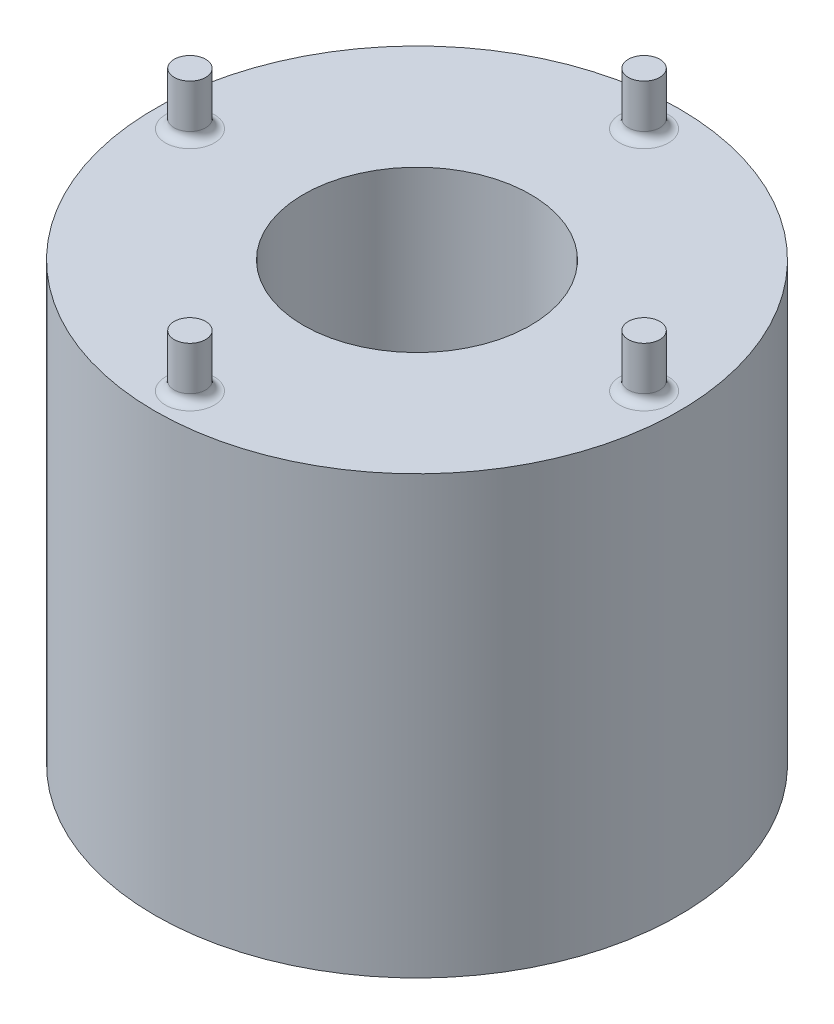
ISO-10303-21;
HEADER;
FILE_DESCRIPTION(('STEP AP214'),'2;1');
FILE_NAME('part.step','',(''),(''),'','','');
FILE_SCHEMA(('AUTOMOTIVE_DESIGN { 1 0 10303 214 1 1 1 1 }'));
ENDSEC;
DATA;
#1=APPLICATION_CONTEXT('core data for automotive mechanical design processes');
#2=APPLICATION_PROTOCOL_DEFINITION('international standard','automotive_design',2000,#1);
#3=PRODUCT_CONTEXT('',#1,'mechanical');
#4=PRODUCT('Part','Part','',(#3));
#5=PRODUCT_RELATED_PRODUCT_CATEGORY('part','',(#4));
#6=PRODUCT_DEFINITION_FORMATION('','',#4);
#7=PRODUCT_DEFINITION_CONTEXT('part definition',#1,'design');
#8=PRODUCT_DEFINITION('design','',#6,#7);
#9=PRODUCT_DEFINITION_SHAPE('','',#8);
#10=(LENGTH_UNIT() NAMED_UNIT(*) SI_UNIT(.MILLI.,.METRE.));
#11=(NAMED_UNIT(*) PLANE_ANGLE_UNIT() SI_UNIT($,.RADIAN.));
#12=(NAMED_UNIT(*) SI_UNIT($,.STERADIAN.) SOLID_ANGLE_UNIT());
#13=UNCERTAINTY_MEASURE_WITH_UNIT(LENGTH_MEASURE(1.E-05),#10,'distance_accuracy_value','');
#14=(GEOMETRIC_REPRESENTATION_CONTEXT(3) GLOBAL_UNCERTAINTY_ASSIGNED_CONTEXT((#13)) GLOBAL_UNIT_ASSIGNED_CONTEXT((#10,
#11,#12)) REPRESENTATION_CONTEXT('',''));
#15=CARTESIAN_POINT('',(0.,0.,0.));
#16=DIRECTION('',(0.,0.,1.));
#17=DIRECTION('',(1.,0.,0.));
#18=AXIS2_PLACEMENT_3D('',#15,#16,#17);
#19=CARTESIAN_POINT('',(0.,10.,0.));
#20=DIRECTION('',(0.,-1.,0.));
#21=DIRECTION('',(0.,0.,-1.));
#22=AXIS2_PLACEMENT_3D('',#19,#20,#21);
#23=CYLINDRICAL_SURFACE('',#22,15.);
#24=CARTESIAN_POINT('',(0.,0.,0.));
#25=DIRECTION('',(0.,1.,0.));
#26=DIRECTION('',(0.,0.,1.));
#27=AXIS2_PLACEMENT_3D('',#24,#25,#26);
#28=CIRCLE('',#27,15.);
#29=CARTESIAN_POINT('',(0.,0.,15.));
#30=VERTEX_POINT('',#29);
#31=EDGE_CURVE('E63',#30,#30,#28,.T.);
#32=ORIENTED_EDGE('',*,*,#31,.T.);
#33=EDGE_LOOP('',(#32));
#34=FACE_BOUND('',#33,.T.);
#35=CARTESIAN_POINT('',(0.,25.,0.));
#36=DIRECTION('',(0.,1.,0.));
#37=DIRECTION('',(0.,0.,1.));
#38=AXIS2_PLACEMENT_3D('',#35,#36,#37);
#39=CIRCLE('',#38,15.);
#40=CARTESIAN_POINT('',(0.,25.,15.));
#41=VERTEX_POINT('',#40);
#42=EDGE_CURVE('E66',#41,#41,#39,.T.);
#43=ORIENTED_EDGE('',*,*,#42,.F.);
#44=EDGE_LOOP('',(#43));
#45=FACE_BOUND('',#44,.T.);
#46=ADVANCED_FACE('F31',(#34,#45),#23,.T.);
#47=CARTESIAN_POINT('',(0.,0.,0.));
#48=DIRECTION('',(0.,1.,0.));
#49=DIRECTION('',(0.,0.,1.));
#50=AXIS2_PLACEMENT_3D('',#47,#48,#49);
#51=PLANE('',#50);
#52=ORIENTED_EDGE('',*,*,#31,.F.);
#53=EDGE_LOOP('',(#52));
#54=FACE_BOUND('',#53,.T.);
#55=ADVANCED_FACE('F117',(#54),#51,.F.);
#56=CARTESIAN_POINT('',(0.,25.,0.));
#57=DIRECTION('',(0.,1.,0.));
#58=DIRECTION('',(0.,0.,1.));
#59=AXIS2_PLACEMENT_3D('',#56,#57,#58);
#60=PLANE('',#59);
#61=CARTESIAN_POINT('',(0.,25.,0.));
#62=DIRECTION('',(0.,1.,0.));
#63=DIRECTION('',(0.,0.,1.));
#64=AXIS2_PLACEMENT_3D('',#61,#62,#63);
#65=CIRCLE('',#64,6.5);
#66=CARTESIAN_POINT('',(0.,25.,6.5));
#67=VERTEX_POINT('',#66);
#68=EDGE_CURVE('E82',#67,#67,#65,.T.);
#69=ORIENTED_EDGE('',*,*,#68,.F.);
#70=EDGE_LOOP('',(#69));
#71=FACE_BOUND('',#70,.T.);
#72=CARTESIAN_POINT('',(-13.,25.,1.36167772214882E-13));
#73=DIRECTION('',(0.,1.,0.));
#74=DIRECTION('',(0.,0.,1.));
#75=AXIS2_PLACEMENT_3D('',#72,#73,#74);
#76=CIRCLE('',#75,1.4);
#77=CARTESIAN_POINT('',(-13.,25.,1.40000000000014));
#78=VERTEX_POINT('',#77);
#79=EDGE_CURVE('E10',#78,#78,#76,.F.);
#80=ORIENTED_EDGE('',*,*,#79,.T.);
#81=EDGE_LOOP('',(#80));
#82=FACE_BOUND('',#81,.T.);
#83=CARTESIAN_POINT('',(0.,25.,-13.));
#84=DIRECTION('',(0.,1.,0.));
#85=DIRECTION('',(0.,0.,1.));
#86=AXIS2_PLACEMENT_3D('',#83,#84,#85);
#87=CIRCLE('',#86,1.4);
#88=CARTESIAN_POINT('',(0.,25.,-11.6));
#89=VERTEX_POINT('',#88);
#90=EDGE_CURVE('E42',#89,#89,#87,.F.);
#91=ORIENTED_EDGE('',*,*,#90,.T.);
#92=EDGE_LOOP('',(#91));
#93=FACE_BOUND('',#92,.T.);
#94=CARTESIAN_POINT('',(13.,25.,0.));
#95=DIRECTION('',(0.,1.,0.));
#96=DIRECTION('',(0.,0.,1.));
#97=AXIS2_PLACEMENT_3D('',#94,#95,#96);
#98=CIRCLE('',#97,1.4);
#99=CARTESIAN_POINT('',(13.,25.,1.39999999999995));
#100=VERTEX_POINT('',#99);
#101=EDGE_CURVE('E51',#100,#100,#98,.F.);
#102=ORIENTED_EDGE('',*,*,#101,.T.);
#103=EDGE_LOOP('',(#102));
#104=FACE_BOUND('',#103,.T.);
#105=CARTESIAN_POINT('',(0.,25.,13.));
#106=DIRECTION('',(0.,1.,0.));
#107=DIRECTION('',(0.,0.,1.));
#108=AXIS2_PLACEMENT_3D('',#105,#106,#107);
#109=CIRCLE('',#108,1.4);
#110=CARTESIAN_POINT('',(0.,25.,14.4));
#111=VERTEX_POINT('',#110);
#112=EDGE_CURVE('E57',#111,#111,#109,.F.);
#113=ORIENTED_EDGE('',*,*,#112,.T.);
#114=EDGE_LOOP('',(#113));
#115=FACE_BOUND('',#114,.T.);
#116=ORIENTED_EDGE('',*,*,#42,.T.);
#117=EDGE_LOOP('',(#116));
#118=FACE_BOUND('',#117,.T.);
#119=ADVANCED_FACE('F114',(#71,#82,#93,#104,#115,#118),#60,.T.);
#120=CARTESIAN_POINT('',(0.,28.,13.));
#121=DIRECTION('',(0.,-1.,0.));
#122=DIRECTION('',(0.,0.,-1.));
#123=AXIS2_PLACEMENT_3D('',#120,#121,#122);
#124=CYLINDRICAL_SURFACE('',#123,0.9);
#125=CARTESIAN_POINT('',(0.,25.5,13.));
#126=DIRECTION('',(0.,1.,0.));
#127=DIRECTION('',(0.,0.,1.));
#128=AXIS2_PLACEMENT_3D('',#125,#126,#127);
#129=CIRCLE('',#128,0.9);
#130=CARTESIAN_POINT('',(0.,25.5,13.9));
#131=VERTEX_POINT('',#130);
#132=EDGE_CURVE('E60',#131,#131,#129,.T.);
#133=ORIENTED_EDGE('',*,*,#132,.T.);
#134=EDGE_LOOP('',(#133));
#135=FACE_BOUND('',#134,.T.);
#136=CARTESIAN_POINT('',(0.,28.,13.));
#137=DIRECTION('',(0.,1.,0.));
#138=DIRECTION('',(0.,0.,1.));
#139=AXIS2_PLACEMENT_3D('',#136,#137,#138);
#140=CIRCLE('',#139,0.9);
#141=CARTESIAN_POINT('',(0.,28.,13.9));
#142=VERTEX_POINT('',#141);
#143=EDGE_CURVE('E69',#142,#142,#140,.T.);
#144=ORIENTED_EDGE('',*,*,#143,.F.);
#145=EDGE_LOOP('',(#144));
#146=FACE_BOUND('',#145,.T.);
#147=ADVANCED_FACE('F116',(#135,#146),#124,.T.);
#148=CARTESIAN_POINT('',(0.,28.,13.));
#149=DIRECTION('',(0.,1.,0.));
#150=DIRECTION('',(0.,0.,1.));
#151=AXIS2_PLACEMENT_3D('',#148,#149,#150);
#152=PLANE('',#151);
#153=ORIENTED_EDGE('',*,*,#143,.T.);
#154=EDGE_LOOP('',(#153));
#155=FACE_BOUND('',#154,.T.);
#156=ADVANCED_FACE('F141',(#155),#152,.T.);
#157=CARTESIAN_POINT('',(0.,25.5,13.));
#158=DIRECTION('',(0.,1.,0.));
#159=DIRECTION('',(0.,0.,1.));
#160=AXIS2_PLACEMENT_3D('',#157,#158,#159);
#161=TOROIDAL_SURFACE('',#160,1.4,0.5);
#162=ORIENTED_EDGE('',*,*,#112,.F.);
#163=EDGE_LOOP('',(#162));
#164=FACE_BOUND('',#163,.T.);
#165=ORIENTED_EDGE('',*,*,#132,.F.);
#166=EDGE_LOOP('',(#165));
#167=FACE_BOUND('',#166,.T.);
#168=ADVANCED_FACE('F137',(#164,#167),#161,.F.);
#169=CARTESIAN_POINT('',(13.,28.,0.));
#170=DIRECTION('',(0.,-1.,0.));
#171=DIRECTION('',(0.,0.,-1.));
#172=AXIS2_PLACEMENT_3D('',#169,#170,#171);
#173=CYLINDRICAL_SURFACE('',#172,0.9);
#174=CARTESIAN_POINT('',(13.,25.5,0.));
#175=DIRECTION('',(0.,1.,0.));
#176=DIRECTION('',(0.,0.,1.));
#177=AXIS2_PLACEMENT_3D('',#174,#175,#176);
#178=CIRCLE('',#177,0.9);
#179=CARTESIAN_POINT('',(13.,25.5,0.899999999999954));
#180=VERTEX_POINT('',#179);
#181=EDGE_CURVE('E54',#180,#180,#178,.T.);
#182=ORIENTED_EDGE('',*,*,#181,.T.);
#183=EDGE_LOOP('',(#182));
#184=FACE_BOUND('',#183,.T.);
#185=CARTESIAN_POINT('',(13.,28.,0.));
#186=DIRECTION('',(0.,1.,0.));
#187=DIRECTION('',(1.,0.,0.));
#188=AXIS2_PLACEMENT_3D('',#185,#186,#187);
#189=CIRCLE('',#188,0.9);
#190=CARTESIAN_POINT('',(13.9,28.,0.));
#191=VERTEX_POINT('',#190);
#192=EDGE_CURVE('E72',#191,#191,#189,.T.);
#193=ORIENTED_EDGE('',*,*,#192,.F.);
#194=EDGE_LOOP('',(#193));
#195=FACE_BOUND('',#194,.T.);
#196=ADVANCED_FACE('F140',(#184,#195),#173,.T.);
#197=CARTESIAN_POINT('',(13.,28.,0.));
#198=DIRECTION('',(0.,1.,0.));
#199=DIRECTION('',(1.,0.,0.));
#200=AXIS2_PLACEMENT_3D('',#197,#198,#199);
#201=PLANE('',#200);
#202=ORIENTED_EDGE('',*,*,#192,.T.);
#203=EDGE_LOOP('',(#202));
#204=FACE_BOUND('',#203,.T.);
#205=ADVANCED_FACE('F161',(#204),#201,.T.);
#206=CARTESIAN_POINT('',(0.,28.,-13.));
#207=DIRECTION('',(0.,-1.,0.));
#208=DIRECTION('',(0.,0.,-1.));
#209=AXIS2_PLACEMENT_3D('',#206,#207,#208);
#210=CYLINDRICAL_SURFACE('',#209,0.9);
#211=CARTESIAN_POINT('',(0.,25.5,-13.));
#212=DIRECTION('',(0.,1.,0.));
#213=DIRECTION('',(0.,0.,1.));
#214=AXIS2_PLACEMENT_3D('',#211,#212,#213);
#215=CIRCLE('',#214,0.9);
#216=CARTESIAN_POINT('',(0.,25.5,-12.1));
#217=VERTEX_POINT('',#216);
#218=EDGE_CURVE('E46',#217,#217,#215,.T.);
#219=ORIENTED_EDGE('',*,*,#218,.T.);
#220=EDGE_LOOP('',(#219));
#221=FACE_BOUND('',#220,.T.);
#222=CARTESIAN_POINT('',(0.,28.,-13.));
#223=DIRECTION('',(0.,1.,0.));
#224=DIRECTION('',(0.,0.,-1.));
#225=AXIS2_PLACEMENT_3D('',#222,#223,#224);
#226=CIRCLE('',#225,0.9);
#227=CARTESIAN_POINT('',(0.,28.,-13.9));
#228=VERTEX_POINT('',#227);
#229=EDGE_CURVE('E75',#228,#228,#226,.T.);
#230=ORIENTED_EDGE('',*,*,#229,.F.);
#231=EDGE_LOOP('',(#230));
#232=FACE_BOUND('',#231,.T.);
#233=ADVANCED_FACE('F157',(#221,#232),#210,.T.);
#234=CARTESIAN_POINT('',(0.,28.,-13.));
#235=DIRECTION('',(0.,1.,0.));
#236=DIRECTION('',(0.,0.,-1.));
#237=AXIS2_PLACEMENT_3D('',#234,#235,#236);
#238=PLANE('',#237);
#239=ORIENTED_EDGE('',*,*,#229,.T.);
#240=EDGE_LOOP('',(#239));
#241=FACE_BOUND('',#240,.T.);
#242=ADVANCED_FACE('F160',(#241),#238,.T.);
#243=CARTESIAN_POINT('',(-13.,28.,1.36167772214882E-13));
#244=DIRECTION('',(0.,-1.,0.));
#245=DIRECTION('',(0.,0.,-1.));
#246=AXIS2_PLACEMENT_3D('',#243,#244,#245);
#247=CYLINDRICAL_SURFACE('',#246,0.9);
#248=CARTESIAN_POINT('',(-13.,25.5,1.36167772214882E-13));
#249=DIRECTION('',(0.,1.,0.));
#250=DIRECTION('',(0.,0.,1.));
#251=AXIS2_PLACEMENT_3D('',#248,#249,#250);
#252=CIRCLE('',#251,0.9);
#253=CARTESIAN_POINT('',(-13.,25.5,0.900000000000136));
#254=VERTEX_POINT('',#253);
#255=EDGE_CURVE('E38',#254,#254,#252,.T.);
#256=ORIENTED_EDGE('',*,*,#255,.T.);
#257=EDGE_LOOP('',(#256));
#258=FACE_BOUND('',#257,.T.);
#259=CARTESIAN_POINT('',(-13.,28.,1.36167772214882E-13));
#260=DIRECTION('',(0.,1.,0.));
#261=DIRECTION('',(-1.,0.,0.));
#262=AXIS2_PLACEMENT_3D('',#259,#260,#261);
#263=CIRCLE('',#262,0.9);
#264=CARTESIAN_POINT('',(-13.9,28.,1.45594771829759E-13));
#265=VERTEX_POINT('',#264);
#266=EDGE_CURVE('E78',#265,#265,#263,.T.);
#267=ORIENTED_EDGE('',*,*,#266,.F.);
#268=EDGE_LOOP('',(#267));
#269=FACE_BOUND('',#268,.T.);
#270=ADVANCED_FACE('F166',(#258,#269),#247,.T.);
#271=CARTESIAN_POINT('',(-13.,28.,1.36167772214882E-13));
#272=DIRECTION('',(0.,1.,0.));
#273=DIRECTION('',(-1.,0.,0.));
#274=AXIS2_PLACEMENT_3D('',#271,#272,#273);
#275=PLANE('',#274);
#276=ORIENTED_EDGE('',*,*,#266,.T.);
#277=EDGE_LOOP('',(#276));
#278=FACE_BOUND('',#277,.T.);
#279=ADVANCED_FACE('F146',(#278),#275,.T.);
#280=CARTESIAN_POINT('',(13.,25.5,0.));
#281=DIRECTION('',(0.,1.,0.));
#282=DIRECTION('',(0.,0.,1.));
#283=AXIS2_PLACEMENT_3D('',#280,#281,#282);
#284=TOROIDAL_SURFACE('',#283,1.4,0.5);
#285=ORIENTED_EDGE('',*,*,#101,.F.);
#286=EDGE_LOOP('',(#285));
#287=FACE_BOUND('',#286,.T.);
#288=ORIENTED_EDGE('',*,*,#181,.F.);
#289=EDGE_LOOP('',(#288));
#290=FACE_BOUND('',#289,.T.);
#291=ADVANCED_FACE('F143',(#287,#290),#284,.F.);
#292=CARTESIAN_POINT('',(0.,25.5,-13.));
#293=DIRECTION('',(0.,1.,0.));
#294=DIRECTION('',(0.,0.,1.));
#295=AXIS2_PLACEMENT_3D('',#292,#293,#294);
#296=TOROIDAL_SURFACE('',#295,1.4,0.5);
#297=ORIENTED_EDGE('',*,*,#90,.F.);
#298=EDGE_LOOP('',(#297));
#299=FACE_BOUND('',#298,.T.);
#300=ORIENTED_EDGE('',*,*,#218,.F.);
#301=EDGE_LOOP('',(#300));
#302=FACE_BOUND('',#301,.T.);
#303=ADVANCED_FACE('F145',(#299,#302),#296,.F.);
#304=CARTESIAN_POINT('',(-13.,25.5,1.36167772214882E-13));
#305=DIRECTION('',(0.,1.,0.));
#306=DIRECTION('',(0.,0.,1.));
#307=AXIS2_PLACEMENT_3D('',#304,#305,#306);
#308=TOROIDAL_SURFACE('',#307,1.4,0.5);
#309=ORIENTED_EDGE('',*,*,#79,.F.);
#310=EDGE_LOOP('',(#309));
#311=FACE_BOUND('',#310,.T.);
#312=ORIENTED_EDGE('',*,*,#255,.F.);
#313=EDGE_LOOP('',(#312));
#314=FACE_BOUND('',#313,.T.);
#315=ADVANCED_FACE('F33',(#311,#314),#308,.F.);
#316=CARTESIAN_POINT('',(0.,15.,0.));
#317=DIRECTION('',(0.,1.,0.));
#318=DIRECTION('',(0.,0.,1.));
#319=AXIS2_PLACEMENT_3D('',#316,#317,#318);
#320=CYLINDRICAL_SURFACE('',#319,6.5);
#321=CARTESIAN_POINT('',(0.,15.,0.));
#322=DIRECTION('',(0.,1.,0.));
#323=DIRECTION('',(0.,0.,1.));
#324=AXIS2_PLACEMENT_3D('',#321,#322,#323);
#325=CIRCLE('',#324,6.5);
#326=CARTESIAN_POINT('',(0.,15.,6.5));
#327=VERTEX_POINT('',#326);
#328=EDGE_CURVE('E81',#327,#327,#325,.T.);
#329=ORIENTED_EDGE('',*,*,#328,.F.);
#330=EDGE_LOOP('',(#329));
#331=FACE_BOUND('',#330,.T.);
#332=ORIENTED_EDGE('',*,*,#68,.T.);
#333=EDGE_LOOP('',(#332));
#334=FACE_BOUND('',#333,.T.);
#335=ADVANCED_FACE('F105',(#331,#334),#320,.F.);
#336=CARTESIAN_POINT('',(0.,15.,0.));
#337=DIRECTION('',(0.,1.,0.));
#338=DIRECTION('',(0.,0.,1.));
#339=AXIS2_PLACEMENT_3D('',#336,#337,#338);
#340=PLANE('',#339);
#341=CARTESIAN_POINT('',(0.,15.,0.));
#342=DIRECTION('',(0.,1.,0.));
#343=DIRECTION('',(0.,0.,1.));
#344=AXIS2_PLACEMENT_3D('',#341,#342,#343);
#345=CIRCLE('',#344,1.75);
#346=CARTESIAN_POINT('',(0.,15.,1.75));
#347=VERTEX_POINT('',#346);
#348=EDGE_CURVE('E88',#347,#347,#345,.T.);
#349=ORIENTED_EDGE('',*,*,#348,.F.);
#350=EDGE_LOOP('',(#349));
#351=FACE_BOUND('',#350,.T.);
#352=ORIENTED_EDGE('',*,*,#328,.T.);
#353=EDGE_LOOP('',(#352));
#354=FACE_BOUND('',#353,.T.);
#355=ADVANCED_FACE('F99',(#351,#354),#340,.T.);
#356=CARTESIAN_POINT('',(0.,5.,0.));
#357=DIRECTION('',(0.,1.,0.));
#358=DIRECTION('',(0.,0.,1.));
#359=AXIS2_PLACEMENT_3D('',#356,#357,#358);
#360=CYLINDRICAL_SURFACE('',#359,1.75);
#361=CARTESIAN_POINT('',(0.,5.,0.));
#362=DIRECTION('',(0.,1.,0.));
#363=DIRECTION('',(0.,0.,1.));
#364=AXIS2_PLACEMENT_3D('',#361,#362,#363);
#365=CIRCLE('',#364,1.75);
#366=CARTESIAN_POINT('',(0.,5.,1.75));
#367=VERTEX_POINT('',#366);
#368=EDGE_CURVE('E85',#367,#367,#365,.T.);
#369=ORIENTED_EDGE('',*,*,#368,.F.);
#370=EDGE_LOOP('',(#369));
#371=FACE_BOUND('',#370,.T.);
#372=ORIENTED_EDGE('',*,*,#348,.T.);
#373=EDGE_LOOP('',(#372));
#374=FACE_BOUND('',#373,.T.);
#375=ADVANCED_FACE('F96',(#371,#374),#360,.F.);
#376=CARTESIAN_POINT('',(0.,5.,0.));
#377=DIRECTION('',(0.,1.,0.));
#378=DIRECTION('',(0.,0.,1.));
#379=AXIS2_PLACEMENT_3D('',#376,#377,#378);
#380=PLANE('',#379);
#381=ORIENTED_EDGE('',*,*,#368,.T.);
#382=EDGE_LOOP('',(#381));
#383=FACE_BOUND('',#382,.T.);
#384=ADVANCED_FACE('F94',(#383),#380,.T.);
#385=CLOSED_SHELL('',(#46,#55,#119,#147,#156,#168,#196,#205,#233,#242,#270,#279,#291,#303,#315,
#335,#355,#375,#384));
#386=MANIFOLD_SOLID_BREP('B2',#385);
#387=ADVANCED_BREP_SHAPE_REPRESENTATION('',(#18,#386),#14);
#388=SHAPE_DEFINITION_REPRESENTATION(#9,#387);
ENDSEC;
END-ISO-10303-21;
